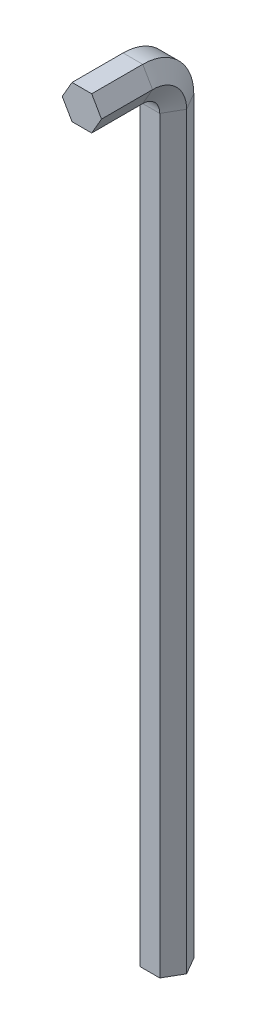
ISO-10303-21;
HEADER;
FILE_DESCRIPTION(('STEP AP214'),'2;1');
FILE_NAME('part.step','',(''),(''),'','','');
FILE_SCHEMA(('AUTOMOTIVE_DESIGN { 1 0 10303 214 1 1 1 1 }'));
ENDSEC;
DATA;
#1=APPLICATION_CONTEXT('core data for automotive mechanical design processes');
#2=APPLICATION_PROTOCOL_DEFINITION('international standard','automotive_design',2000,#1);
#3=PRODUCT_CONTEXT('',#1,'mechanical');
#4=PRODUCT('Part','Part','',(#3));
#5=PRODUCT_RELATED_PRODUCT_CATEGORY('part','',(#4));
#6=PRODUCT_DEFINITION_FORMATION('','',#4);
#7=PRODUCT_DEFINITION_CONTEXT('part definition',#1,'design');
#8=PRODUCT_DEFINITION('design','',#6,#7);
#9=PRODUCT_DEFINITION_SHAPE('','',#8);
#10=(LENGTH_UNIT() NAMED_UNIT(*) SI_UNIT(.MILLI.,.METRE.));
#11=(NAMED_UNIT(*) PLANE_ANGLE_UNIT() SI_UNIT($,.RADIAN.));
#12=(NAMED_UNIT(*) SI_UNIT($,.STERADIAN.) SOLID_ANGLE_UNIT());
#13=UNCERTAINTY_MEASURE_WITH_UNIT(LENGTH_MEASURE(1.E-05),#10,'distance_accuracy_value','');
#14=(GEOMETRIC_REPRESENTATION_CONTEXT(3) GLOBAL_UNCERTAINTY_ASSIGNED_CONTEXT((#13)) GLOBAL_UNIT_ASSIGNED_CONTEXT((#10,
#11,#12)) REPRESENTATION_CONTEXT('',''));
#15=CARTESIAN_POINT('',(0.,0.,0.));
#16=DIRECTION('',(0.,0.,1.));
#17=DIRECTION('',(1.,0.,0.));
#18=AXIS2_PLACEMENT_3D('',#15,#16,#17);
#19=CARTESIAN_POINT('',(2.88675134594813,220.,5.));
#20=DIRECTION('',(-0.866025403784439,0.,-0.5));
#21=DIRECTION('',(-0.5,0.,0.866025403784439));
#22=AXIS2_PLACEMENT_3D('',#19,#20,#21);
#23=PLANE('',#22);
#24=DIRECTION('',(0.5,0.,-0.866025403784439));
#25=VECTOR('',#24,1.);
#26=CARTESIAN_POINT('',(2.88675134594813,0.,5.));
#27=LINE('',#26,#25);
#28=CARTESIAN_POINT('',(2.88675134594813,0.,5.));
#29=VERTEX_POINT('',#28);
#30=CARTESIAN_POINT('',(5.77350269189626,0.,0.));
#31=VERTEX_POINT('',#30);
#32=EDGE_CURVE('E139',#29,#31,#27,.T.);
#33=ORIENTED_EDGE('',*,*,#32,.T.);
#34=DIRECTION('',(0.,-1.,0.));
#35=VECTOR('',#34,1.);
#36=CARTESIAN_POINT('',(5.77350269189626,220.,0.));
#37=LINE('',#36,#35);
#38=CARTESIAN_POINT('',(5.77350269189626,220.,0.));
#39=VERTEX_POINT('',#38);
#40=EDGE_CURVE('E11',#39,#31,#37,.T.);
#41=ORIENTED_EDGE('',*,*,#40,.F.);
#42=DIRECTION('',(0.5,0.,-0.866025403784439));
#43=VECTOR('',#42,1.);
#44=CARTESIAN_POINT('',(2.88675134594813,220.,5.));
#45=LINE('',#44,#43);
#46=CARTESIAN_POINT('',(2.88675134594813,220.,5.));
#47=VERTEX_POINT('',#46);
#48=EDGE_CURVE('E129',#47,#39,#45,.T.);
#49=ORIENTED_EDGE('',*,*,#48,.F.);
#50=DIRECTION('',(0.,-1.,0.));
#51=VECTOR('',#50,1.);
#52=CARTESIAN_POINT('',(2.88675134594813,220.,5.));
#53=LINE('',#52,#51);
#54=EDGE_CURVE('E138',#47,#29,#53,.T.);
#55=ORIENTED_EDGE('',*,*,#54,.T.);
#56=EDGE_LOOP('',(#33,#41,#49,#55));
#57=FACE_BOUND('',#56,.T.);
#58=ADVANCED_FACE('F32',(#57),#23,.F.);
#59=CARTESIAN_POINT('',(5.77350269189626,220.,0.));
#60=DIRECTION('',(-0.866025403784439,0.,0.5));
#61=DIRECTION('',(0.5,0.,0.866025403784439));
#62=AXIS2_PLACEMENT_3D('',#59,#60,#61);
#63=PLANE('',#62);
#64=DIRECTION('',(-0.5,0.,-0.866025403784438));
#65=VECTOR('',#64,1.);
#66=CARTESIAN_POINT('',(5.77350269189626,0.,0.));
#67=LINE('',#66,#65);
#68=CARTESIAN_POINT('',(2.88675134594813,0.,-5.));
#69=VERTEX_POINT('',#68);
#70=EDGE_CURVE('E142',#31,#69,#67,.T.);
#71=ORIENTED_EDGE('',*,*,#70,.T.);
#72=DIRECTION('',(0.,-1.,0.));
#73=VECTOR('',#72,1.);
#74=CARTESIAN_POINT('',(2.88675134594813,220.,-5.));
#75=LINE('',#74,#73);
#76=CARTESIAN_POINT('',(2.88675134594813,220.,-5.));
#77=VERTEX_POINT('',#76);
#78=EDGE_CURVE('E40',#77,#69,#75,.T.);
#79=ORIENTED_EDGE('',*,*,#78,.F.);
#80=DIRECTION('',(-0.5,0.,-0.866025403784438));
#81=VECTOR('',#80,1.);
#82=CARTESIAN_POINT('',(5.77350269189626,220.,0.));
#83=LINE('',#82,#81);
#84=EDGE_CURVE('E84',#39,#77,#83,.T.);
#85=ORIENTED_EDGE('',*,*,#84,.F.);
#86=ORIENTED_EDGE('',*,*,#40,.T.);
#87=EDGE_LOOP('',(#71,#79,#85,#86));
#88=FACE_BOUND('',#87,.T.);
#89=ADVANCED_FACE('F296',(#88),#63,.F.);
#90=CARTESIAN_POINT('',(2.88675134594813,220.,-5.));
#91=DIRECTION('',(0.,0.,1.));
#92=DIRECTION('',(1.,0.,0.));
#93=AXIS2_PLACEMENT_3D('',#90,#91,#92);
#94=PLANE('',#93);
#95=DIRECTION('',(-1.,0.,0.));
#96=VECTOR('',#95,1.);
#97=CARTESIAN_POINT('',(2.88675134594813,0.,-5.));
#98=LINE('',#97,#96);
#99=CARTESIAN_POINT('',(-2.88675134594813,0.,-5.));
#100=VERTEX_POINT('',#99);
#101=EDGE_CURVE('E101',#69,#100,#98,.T.);
#102=ORIENTED_EDGE('',*,*,#101,.T.);
#103=DIRECTION('',(0.,-1.,0.));
#104=VECTOR('',#103,1.);
#105=CARTESIAN_POINT('',(-2.88675134594813,220.,-5.));
#106=LINE('',#105,#104);
#107=CARTESIAN_POINT('',(-2.88675134594813,220.,-5.));
#108=VERTEX_POINT('',#107);
#109=EDGE_CURVE('E93',#108,#100,#106,.T.);
#110=ORIENTED_EDGE('',*,*,#109,.F.);
#111=DIRECTION('',(-1.,0.,0.));
#112=VECTOR('',#111,1.);
#113=CARTESIAN_POINT('',(2.88675134594813,220.,-5.));
#114=LINE('',#113,#112);
#115=EDGE_CURVE('E98',#77,#108,#114,.T.);
#116=ORIENTED_EDGE('',*,*,#115,.F.);
#117=ORIENTED_EDGE('',*,*,#78,.T.);
#118=EDGE_LOOP('',(#102,#110,#116,#117));
#119=FACE_BOUND('',#118,.T.);
#120=ADVANCED_FACE('F95',(#119),#94,.F.);
#121=CARTESIAN_POINT('',(-2.88675134594813,220.,-5.));
#122=DIRECTION('',(0.866025403784439,0.,0.5));
#123=DIRECTION('',(0.5,0.,-0.866025403784439));
#124=AXIS2_PLACEMENT_3D('',#121,#122,#123);
#125=PLANE('',#124);
#126=DIRECTION('',(-0.5,0.,0.866025403784439));
#127=VECTOR('',#126,1.);
#128=CARTESIAN_POINT('',(-2.88675134594813,0.,-5.));
#129=LINE('',#128,#127);
#130=CARTESIAN_POINT('',(-5.77350269189626,0.,0.));
#131=VERTEX_POINT('',#130);
#132=EDGE_CURVE('E146',#100,#131,#129,.T.);
#133=ORIENTED_EDGE('',*,*,#132,.T.);
#134=DIRECTION('',(0.,-1.,0.));
#135=VECTOR('',#134,1.);
#136=CARTESIAN_POINT('',(-5.77350269189626,220.,0.));
#137=LINE('',#136,#135);
#138=CARTESIAN_POINT('',(-5.77350269189626,220.,0.));
#139=VERTEX_POINT('',#138);
#140=EDGE_CURVE('E104',#139,#131,#137,.T.);
#141=ORIENTED_EDGE('',*,*,#140,.F.);
#142=DIRECTION('',(-0.5,0.,0.866025403784439));
#143=VECTOR('',#142,1.);
#144=CARTESIAN_POINT('',(-2.88675134594813,220.,-5.));
#145=LINE('',#144,#143);
#146=EDGE_CURVE('E107',#108,#139,#145,.T.);
#147=ORIENTED_EDGE('',*,*,#146,.F.);
#148=ORIENTED_EDGE('',*,*,#109,.T.);
#149=EDGE_LOOP('',(#133,#141,#147,#148));
#150=FACE_BOUND('',#149,.T.);
#151=ADVANCED_FACE('F109',(#150),#125,.F.);
#152=CARTESIAN_POINT('',(-5.77350269189626,220.,0.));
#153=DIRECTION('',(0.866025403784439,0.,-0.5));
#154=DIRECTION('',(-0.5,0.,-0.866025403784439));
#155=AXIS2_PLACEMENT_3D('',#152,#153,#154);
#156=PLANE('',#155);
#157=DIRECTION('',(0.5,0.,0.866025403784439));
#158=VECTOR('',#157,1.);
#159=CARTESIAN_POINT('',(-5.77350269189626,0.,0.));
#160=LINE('',#159,#158);
#161=CARTESIAN_POINT('',(-2.88675134594813,0.,5.));
#162=VERTEX_POINT('',#161);
#163=EDGE_CURVE('E70',#131,#162,#160,.T.);
#164=ORIENTED_EDGE('',*,*,#163,.T.);
#165=DIRECTION('',(0.,-1.,0.));
#166=VECTOR('',#165,1.);
#167=CARTESIAN_POINT('',(-2.88675134594813,220.,5.));
#168=LINE('',#167,#166);
#169=CARTESIAN_POINT('',(-2.88675134594813,220.,5.));
#170=VERTEX_POINT('',#169);
#171=EDGE_CURVE('E48',#170,#162,#168,.T.);
#172=ORIENTED_EDGE('',*,*,#171,.F.);
#173=DIRECTION('',(0.5,0.,0.866025403784439));
#174=VECTOR('',#173,1.);
#175=CARTESIAN_POINT('',(-5.77350269189626,220.,0.));
#176=LINE('',#175,#174);
#177=EDGE_CURVE('E112',#139,#170,#176,.T.);
#178=ORIENTED_EDGE('',*,*,#177,.F.);
#179=ORIENTED_EDGE('',*,*,#140,.T.);
#180=EDGE_LOOP('',(#164,#172,#178,#179));
#181=FACE_BOUND('',#180,.T.);
#182=ADVANCED_FACE('F155',(#181),#156,.F.);
#183=CARTESIAN_POINT('',(-2.88675134594813,220.,5.));
#184=DIRECTION('',(0.,0.,-1.));
#185=DIRECTION('',(-1.,0.,0.));
#186=AXIS2_PLACEMENT_3D('',#183,#184,#185);
#187=PLANE('',#186);
#188=DIRECTION('',(1.,0.,0.));
#189=VECTOR('',#188,1.);
#190=CARTESIAN_POINT('',(-2.88675134594813,0.,5.));
#191=LINE('',#190,#189);
#192=EDGE_CURVE('E76',#162,#29,#191,.T.);
#193=ORIENTED_EDGE('',*,*,#192,.T.);
#194=ORIENTED_EDGE('',*,*,#54,.F.);
#195=DIRECTION('',(1.,0.,0.));
#196=VECTOR('',#195,1.);
#197=CARTESIAN_POINT('',(-2.88675134594813,220.,5.));
#198=LINE('',#197,#196);
#199=EDGE_CURVE('E135',#170,#47,#198,.T.);
#200=ORIENTED_EDGE('',*,*,#199,.F.);
#201=ORIENTED_EDGE('',*,*,#171,.T.);
#202=EDGE_LOOP('',(#193,#194,#200,#201));
#203=FACE_BOUND('',#202,.T.);
#204=ADVANCED_FACE('F192',(#203),#187,.F.);
#205=CARTESIAN_POINT('',(0.,0.,0.));
#206=DIRECTION('',(0.,1.,0.));
#207=DIRECTION('',(0.,0.,1.));
#208=AXIS2_PLACEMENT_3D('',#205,#206,#207);
#209=PLANE('',#208);
#210=ORIENTED_EDGE('',*,*,#32,.F.);
#211=ORIENTED_EDGE('',*,*,#192,.F.);
#212=ORIENTED_EDGE('',*,*,#163,.F.);
#213=ORIENTED_EDGE('',*,*,#132,.F.);
#214=ORIENTED_EDGE('',*,*,#101,.F.);
#215=ORIENTED_EDGE('',*,*,#70,.F.);
#216=EDGE_LOOP('',(#210,#211,#212,#213,#214,#215));
#217=FACE_BOUND('',#216,.T.);
#218=ADVANCED_FACE('F154',(#217),#209,.F.);
#219=CARTESIAN_POINT('',(-5.77350269189626,220.,10.));
#220=DIRECTION('',(-1.,0.,0.));
#221=DIRECTION('',(0.,0.,1.));
#222=AXIS2_PLACEMENT_3D('',#219,#220,#221);
#223=CONICAL_SURFACE('',#222,10.,1.0471975511966);
#224=CARTESIAN_POINT('',(-2.88675134594813,220.,10.));
#225=DIRECTION('',(-1.,0.,0.));
#226=DIRECTION('',(0.,0.,1.));
#227=AXIS2_PLACEMENT_3D('',#224,#225,#226);
#228=CIRCLE('',#227,5.);
#229=CARTESIAN_POINT('',(-2.88675134594813,225.,10.));
#230=VERTEX_POINT('',#229);
#231=EDGE_CURVE('E143',#230,#170,#228,.T.);
#232=ORIENTED_EDGE('',*,*,#231,.F.);
#233=DIRECTION('',(0.5,-0.866025403784439,0.));
#234=VECTOR('',#233,1.);
#235=CARTESIAN_POINT('',(-5.77350269189626,230.,10.));
#236=LINE('',#235,#234);
#237=CARTESIAN_POINT('',(-5.77350269189626,230.,9.99999999999923));
#238=VERTEX_POINT('',#237);
#239=EDGE_CURVE('E163',#238,#230,#236,.T.);
#240=ORIENTED_EDGE('',*,*,#239,.F.);
#241=CARTESIAN_POINT('',(-5.77350269189626,220.,10.));
#242=DIRECTION('',(-1.,0.,0.));
#243=DIRECTION('',(0.,0.,1.));
#244=AXIS2_PLACEMENT_3D('',#241,#242,#243);
#245=CIRCLE('',#244,10.);
#246=EDGE_CURVE('E124',#238,#139,#245,.T.);
#247=ORIENTED_EDGE('',*,*,#246,.T.);
#248=ORIENTED_EDGE('',*,*,#177,.T.);
#249=EDGE_LOOP('',(#232,#240,#247,#248));
#250=FACE_BOUND('',#249,.T.);
#251=ADVANCED_FACE('F160',(#250),#223,.F.);
#252=CARTESIAN_POINT('',(-6.61025250225014,220.,10.));
#253=DIRECTION('',(-1.,0.,0.));
#254=DIRECTION('',(0.,0.,1.));
#255=AXIS2_PLACEMENT_3D('',#252,#253,#254);
#256=CYLINDRICAL_SURFACE('',#255,5.);
#257=CARTESIAN_POINT('',(2.88675134594813,220.,10.));
#258=DIRECTION('',(-1.,0.,0.));
#259=DIRECTION('',(0.,0.,1.));
#260=AXIS2_PLACEMENT_3D('',#257,#258,#259);
#261=CIRCLE('',#260,5.);
#262=CARTESIAN_POINT('',(2.88675134594813,225.,10.));
#263=VERTEX_POINT('',#262);
#264=EDGE_CURVE('E174',#263,#47,#261,.T.);
#265=ORIENTED_EDGE('',*,*,#264,.F.);
#266=DIRECTION('',(1.,0.,0.));
#267=VECTOR('',#266,1.);
#268=CARTESIAN_POINT('',(-2.88675134594813,225.,10.));
#269=LINE('',#268,#267);
#270=EDGE_CURVE('E197',#230,#263,#269,.T.);
#271=ORIENTED_EDGE('',*,*,#270,.F.);
#272=ORIENTED_EDGE('',*,*,#231,.T.);
#273=ORIENTED_EDGE('',*,*,#199,.T.);
#274=EDGE_LOOP('',(#265,#271,#272,#273));
#275=FACE_BOUND('',#274,.T.);
#276=ADVANCED_FACE('F195',(#275),#256,.F.);
#277=CARTESIAN_POINT('',(2.88675134594813,220.,10.));
#278=DIRECTION('',(1.,0.,0.));
#279=DIRECTION('',(0.,0.,-1.));
#280=AXIS2_PLACEMENT_3D('',#277,#278,#279);
#281=CONICAL_SURFACE('',#280,5.,1.0471975511966);
#282=CARTESIAN_POINT('',(5.77350269189626,220.,10.));
#283=DIRECTION('',(-1.,0.,0.));
#284=DIRECTION('',(0.,0.,1.));
#285=AXIS2_PLACEMENT_3D('',#282,#283,#284);
#286=CIRCLE('',#285,10.);
#287=CARTESIAN_POINT('',(5.77350269189626,230.,10.));
#288=VERTEX_POINT('',#287);
#289=EDGE_CURVE('E171',#288,#39,#286,.T.);
#290=ORIENTED_EDGE('',*,*,#289,.F.);
#291=DIRECTION('',(0.5,0.866025403784439,0.));
#292=VECTOR('',#291,1.);
#293=CARTESIAN_POINT('',(2.88675134594813,225.,10.));
#294=LINE('',#293,#292);
#295=EDGE_CURVE('E223',#263,#288,#294,.T.);
#296=ORIENTED_EDGE('',*,*,#295,.F.);
#297=ORIENTED_EDGE('',*,*,#264,.T.);
#298=ORIENTED_EDGE('',*,*,#48,.T.);
#299=EDGE_LOOP('',(#290,#296,#297,#298));
#300=FACE_BOUND('',#299,.T.);
#301=ADVANCED_FACE('F182',(#300),#281,.F.);
#302=CARTESIAN_POINT('',(5.77350269189626,220.,10.));
#303=DIRECTION('',(-1.,0.,0.));
#304=DIRECTION('',(0.,0.,1.));
#305=AXIS2_PLACEMENT_3D('',#302,#303,#304);
#306=CONICAL_SURFACE('',#305,10.,1.0471975511966);
#307=CARTESIAN_POINT('',(2.88675134594813,220.,10.));
#308=DIRECTION('',(-1.,0.,0.));
#309=DIRECTION('',(0.,0.,1.));
#310=AXIS2_PLACEMENT_3D('',#307,#308,#309);
#311=CIRCLE('',#310,15.);
#312=CARTESIAN_POINT('',(2.88675134594813,235.,10.0000000000001));
#313=VERTEX_POINT('',#312);
#314=EDGE_CURVE('E123',#313,#77,#311,.T.);
#315=ORIENTED_EDGE('',*,*,#314,.F.);
#316=DIRECTION('',(-0.5,0.866025403784438,0.));
#317=VECTOR('',#316,1.);
#318=CARTESIAN_POINT('',(5.77350269189626,230.,10.));
#319=LINE('',#318,#317);
#320=EDGE_CURVE('E207',#288,#313,#319,.T.);
#321=ORIENTED_EDGE('',*,*,#320,.F.);
#322=ORIENTED_EDGE('',*,*,#289,.T.);
#323=ORIENTED_EDGE('',*,*,#84,.T.);
#324=EDGE_LOOP('',(#315,#321,#322,#323));
#325=FACE_BOUND('',#324,.T.);
#326=ADVANCED_FACE('F205',(#325),#306,.T.);
#327=CARTESIAN_POINT('',(-6.61025250225014,220.,10.));
#328=DIRECTION('',(-1.,0.,0.));
#329=DIRECTION('',(0.,0.,1.));
#330=AXIS2_PLACEMENT_3D('',#327,#328,#329);
#331=CYLINDRICAL_SURFACE('',#330,15.);
#332=CARTESIAN_POINT('',(-2.88675134594813,220.,10.));
#333=DIRECTION('',(-1.,0.,0.));
#334=DIRECTION('',(0.,0.,1.));
#335=AXIS2_PLACEMENT_3D('',#332,#333,#334);
#336=CIRCLE('',#335,15.);
#337=CARTESIAN_POINT('',(-2.88675134594813,235.,10.0000000000001));
#338=VERTEX_POINT('',#337);
#339=EDGE_CURVE('E116',#338,#108,#336,.T.);
#340=ORIENTED_EDGE('',*,*,#339,.F.);
#341=DIRECTION('',(-1.,0.,0.));
#342=VECTOR('',#341,1.);
#343=CARTESIAN_POINT('',(2.88675134594813,235.,10.0000000000001));
#344=LINE('',#343,#342);
#345=EDGE_CURVE('E166',#313,#338,#344,.T.);
#346=ORIENTED_EDGE('',*,*,#345,.F.);
#347=ORIENTED_EDGE('',*,*,#314,.T.);
#348=ORIENTED_EDGE('',*,*,#115,.T.);
#349=EDGE_LOOP('',(#340,#346,#347,#348));
#350=FACE_BOUND('',#349,.T.);
#351=ADVANCED_FACE('F126',(#350),#331,.T.);
#352=CARTESIAN_POINT('',(-2.88675134594813,220.,10.));
#353=DIRECTION('',(1.,0.,0.));
#354=DIRECTION('',(0.,0.,-1.));
#355=AXIS2_PLACEMENT_3D('',#352,#353,#354);
#356=CONICAL_SURFACE('',#355,15.,1.0471975511966);
#357=DIRECTION('',(-0.5,-0.866025403784439,0.));
#358=VECTOR('',#357,1.);
#359=CARTESIAN_POINT('',(-2.88675134594813,235.,10.0000000000001));
#360=LINE('',#359,#358);
#361=EDGE_CURVE('E119',#338,#238,#360,.T.);
#362=ORIENTED_EDGE('',*,*,#361,.F.);
#363=ORIENTED_EDGE('',*,*,#339,.T.);
#364=ORIENTED_EDGE('',*,*,#146,.T.);
#365=ORIENTED_EDGE('',*,*,#246,.F.);
#366=EDGE_LOOP('',(#362,#363,#364,#365));
#367=FACE_BOUND('',#366,.T.);
#368=ADVANCED_FACE('F117',(#367),#356,.T.);
#369=CARTESIAN_POINT('',(-2.88675134594813,235.,24.9999999999992));
#370=DIRECTION('',(0.866025403784439,-0.5,0.));
#371=DIRECTION('',(0.5,0.866025403784439,0.));
#372=AXIS2_PLACEMENT_3D('',#369,#370,#371);
#373=PLANE('',#372);
#374=ORIENTED_EDGE('',*,*,#361,.T.);
#375=DIRECTION('',(0.,0.,-1.));
#376=VECTOR('',#375,1.);
#377=CARTESIAN_POINT('',(-5.77350269189626,230.,24.9999999999992));
#378=LINE('',#377,#376);
#379=CARTESIAN_POINT('',(-5.77350269189626,230.,24.9999999999992));
#380=VERTEX_POINT('',#379);
#381=EDGE_CURVE('E240',#380,#238,#378,.T.);
#382=ORIENTED_EDGE('',*,*,#381,.F.);
#383=DIRECTION('',(-0.5,-0.866025403784439,0.));
#384=VECTOR('',#383,1.);
#385=CARTESIAN_POINT('',(-2.88675134594813,235.,24.9999999999992));
#386=LINE('',#385,#384);
#387=CARTESIAN_POINT('',(-2.88675134594813,235.,24.9999999999992));
#388=VERTEX_POINT('',#387);
#389=EDGE_CURVE('E275',#388,#380,#386,.T.);
#390=ORIENTED_EDGE('',*,*,#389,.F.);
#391=DIRECTION('',(0.,0.,-1.));
#392=VECTOR('',#391,1.);
#393=CARTESIAN_POINT('',(-2.88675134594813,235.,24.9999999999992));
#394=LINE('',#393,#392);
#395=EDGE_CURVE('E228',#388,#338,#394,.T.);
#396=ORIENTED_EDGE('',*,*,#395,.T.);
#397=EDGE_LOOP('',(#374,#382,#390,#396));
#398=FACE_BOUND('',#397,.T.);
#399=ADVANCED_FACE('F279',(#398),#373,.F.);
#400=CARTESIAN_POINT('',(-5.77350269189626,230.,24.9999999999992));
#401=DIRECTION('',(0.866025403784439,0.5,0.));
#402=DIRECTION('',(-0.5,0.866025403784439,0.));
#403=AXIS2_PLACEMENT_3D('',#400,#401,#402);
#404=PLANE('',#403);
#405=ORIENTED_EDGE('',*,*,#239,.T.);
#406=DIRECTION('',(0.,0.,-1.));
#407=VECTOR('',#406,1.);
#408=CARTESIAN_POINT('',(-2.88675134594813,225.,24.9999999999992));
#409=LINE('',#408,#407);
#410=CARTESIAN_POINT('',(-2.88675134594813,225.,24.9999999999992));
#411=VERTEX_POINT('',#410);
#412=EDGE_CURVE('E237',#411,#230,#409,.T.);
#413=ORIENTED_EDGE('',*,*,#412,.F.);
#414=DIRECTION('',(0.5,-0.866025403784439,0.));
#415=VECTOR('',#414,1.);
#416=CARTESIAN_POINT('',(-5.77350269189626,230.,24.9999999999992));
#417=LINE('',#416,#415);
#418=EDGE_CURVE('E262',#380,#411,#417,.T.);
#419=ORIENTED_EDGE('',*,*,#418,.F.);
#420=ORIENTED_EDGE('',*,*,#381,.T.);
#421=EDGE_LOOP('',(#405,#413,#419,#420));
#422=FACE_BOUND('',#421,.T.);
#423=ADVANCED_FACE('F259',(#422),#404,.F.);
#424=CARTESIAN_POINT('',(-2.88675134594813,225.,24.9999999999992));
#425=DIRECTION('',(0.,1.,0.));
#426=DIRECTION('',(0.,0.,1.));
#427=AXIS2_PLACEMENT_3D('',#424,#425,#426);
#428=PLANE('',#427);
#429=ORIENTED_EDGE('',*,*,#270,.T.);
#430=DIRECTION('',(0.,0.,-1.));
#431=VECTOR('',#430,1.);
#432=CARTESIAN_POINT('',(2.88675134594813,225.,24.9999999999992));
#433=LINE('',#432,#431);
#434=CARTESIAN_POINT('',(2.88675134594813,225.,24.9999999999992));
#435=VERTEX_POINT('',#434);
#436=EDGE_CURVE('E230',#435,#263,#433,.T.);
#437=ORIENTED_EDGE('',*,*,#436,.F.);
#438=DIRECTION('',(1.,0.,0.));
#439=VECTOR('',#438,1.);
#440=CARTESIAN_POINT('',(-2.88675134594813,225.,24.9999999999992));
#441=LINE('',#440,#439);
#442=EDGE_CURVE('E256',#411,#435,#441,.T.);
#443=ORIENTED_EDGE('',*,*,#442,.F.);
#444=ORIENTED_EDGE('',*,*,#412,.T.);
#445=EDGE_LOOP('',(#429,#437,#443,#444));
#446=FACE_BOUND('',#445,.T.);
#447=ADVANCED_FACE('F250',(#446),#428,.F.);
#448=CARTESIAN_POINT('',(2.88675134594813,225.,24.9999999999992));
#449=DIRECTION('',(-0.866025403784439,0.5,0.));
#450=DIRECTION('',(-0.5,-0.866025403784439,0.));
#451=AXIS2_PLACEMENT_3D('',#448,#449,#450);
#452=PLANE('',#451);
#453=ORIENTED_EDGE('',*,*,#295,.T.);
#454=DIRECTION('',(0.,0.,-1.));
#455=VECTOR('',#454,1.);
#456=CARTESIAN_POINT('',(5.77350269189626,230.,24.9999999999992));
#457=LINE('',#456,#455);
#458=CARTESIAN_POINT('',(5.77350269189626,230.,24.9999999999992));
#459=VERTEX_POINT('',#458);
#460=EDGE_CURVE('E222',#459,#288,#457,.T.);
#461=ORIENTED_EDGE('',*,*,#460,.F.);
#462=DIRECTION('',(0.5,0.866025403784439,0.));
#463=VECTOR('',#462,1.);
#464=CARTESIAN_POINT('',(2.88675134594813,225.,24.9999999999992));
#465=LINE('',#464,#463);
#466=EDGE_CURVE('E284',#435,#459,#465,.T.);
#467=ORIENTED_EDGE('',*,*,#466,.F.);
#468=ORIENTED_EDGE('',*,*,#436,.T.);
#469=EDGE_LOOP('',(#453,#461,#467,#468));
#470=FACE_BOUND('',#469,.T.);
#471=ADVANCED_FACE('F245',(#470),#452,.F.);
#472=CARTESIAN_POINT('',(5.77350269189626,230.,24.9999999999992));
#473=DIRECTION('',(-0.866025403784439,-0.5,0.));
#474=DIRECTION('',(0.5,-0.866025403784439,0.));
#475=AXIS2_PLACEMENT_3D('',#472,#473,#474);
#476=PLANE('',#475);
#477=ORIENTED_EDGE('',*,*,#320,.T.);
#478=DIRECTION('',(0.,0.,-1.));
#479=VECTOR('',#478,1.);
#480=CARTESIAN_POINT('',(2.88675134594813,235.,24.9999999999992));
#481=LINE('',#480,#479);
#482=CARTESIAN_POINT('',(2.88675134594813,235.,24.9999999999992));
#483=VERTEX_POINT('',#482);
#484=EDGE_CURVE('E219',#483,#313,#481,.T.);
#485=ORIENTED_EDGE('',*,*,#484,.F.);
#486=DIRECTION('',(-0.5,0.866025403784439,0.));
#487=VECTOR('',#486,1.);
#488=CARTESIAN_POINT('',(5.77350269189626,230.,24.9999999999992));
#489=LINE('',#488,#487);
#490=EDGE_CURVE('E277',#459,#483,#489,.T.);
#491=ORIENTED_EDGE('',*,*,#490,.F.);
#492=ORIENTED_EDGE('',*,*,#460,.T.);
#493=EDGE_LOOP('',(#477,#485,#491,#492));
#494=FACE_BOUND('',#493,.T.);
#495=ADVANCED_FACE('F216',(#494),#476,.F.);
#496=CARTESIAN_POINT('',(2.88675134594813,235.,24.9999999999992));
#497=DIRECTION('',(0.,-1.,0.));
#498=DIRECTION('',(0.,0.,-1.));
#499=AXIS2_PLACEMENT_3D('',#496,#497,#498);
#500=PLANE('',#499);
#501=ORIENTED_EDGE('',*,*,#345,.T.);
#502=ORIENTED_EDGE('',*,*,#395,.F.);
#503=DIRECTION('',(-1.,0.,0.));
#504=VECTOR('',#503,1.);
#505=CARTESIAN_POINT('',(2.88675134594813,235.,24.9999999999992));
#506=LINE('',#505,#504);
#507=EDGE_CURVE('E227',#483,#388,#506,.T.);
#508=ORIENTED_EDGE('',*,*,#507,.F.);
#509=ORIENTED_EDGE('',*,*,#484,.T.);
#510=EDGE_LOOP('',(#501,#502,#508,#509));
#511=FACE_BOUND('',#510,.T.);
#512=ADVANCED_FACE('F225',(#511),#500,.F.);
#513=CARTESIAN_POINT('',(0.,0.,24.9999999999992));
#514=DIRECTION('',(0.,0.,1.));
#515=DIRECTION('',(1.,0.,0.));
#516=AXIS2_PLACEMENT_3D('',#513,#514,#515);
#517=PLANE('',#516);
#518=ORIENTED_EDGE('',*,*,#389,.T.);
#519=ORIENTED_EDGE('',*,*,#418,.T.);
#520=ORIENTED_EDGE('',*,*,#442,.T.);
#521=ORIENTED_EDGE('',*,*,#466,.T.);
#522=ORIENTED_EDGE('',*,*,#490,.T.);
#523=ORIENTED_EDGE('',*,*,#507,.T.);
#524=EDGE_LOOP('',(#518,#519,#520,#521,#522,#523));
#525=FACE_BOUND('',#524,.T.);
#526=ADVANCED_FACE('F273',(#525),#517,.T.);
#527=CLOSED_SHELL('',(#58,#89,#120,#151,#182,#204,#218,#251,#276,#301,#326,#351,#368,#399,#423,
#447,#471,#495,#512,#526));
#528=MANIFOLD_SOLID_BREP('B2',#527);
#529=ADVANCED_BREP_SHAPE_REPRESENTATION('',(#18,#528),#14);
#530=SHAPE_DEFINITION_REPRESENTATION(#9,#529);
ENDSEC;
END-ISO-10303-21;
